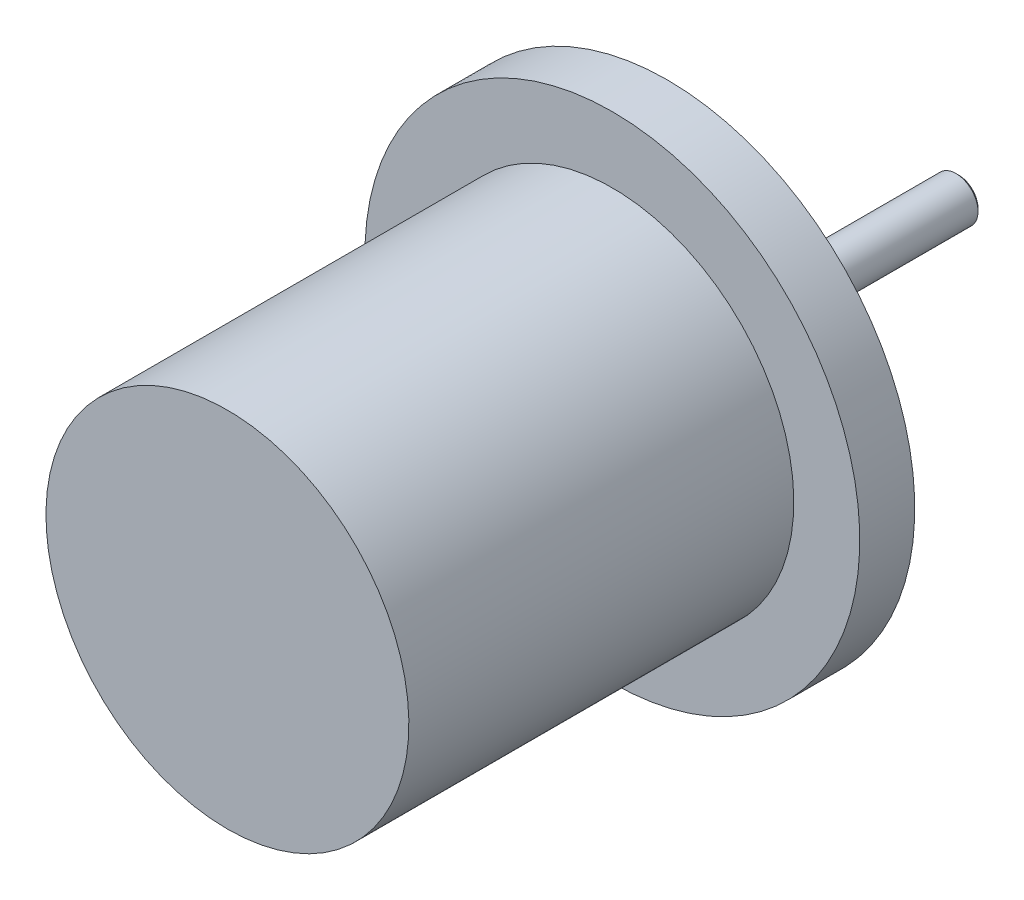
ISO-10303-21;
HEADER;
FILE_DESCRIPTION(('STEP AP214'),'2;1');
FILE_NAME('part.step','',(''),(''),'','','');
FILE_SCHEMA(('AUTOMOTIVE_DESIGN { 1 0 10303 214 1 1 1 1 }'));
ENDSEC;
DATA;
#1=APPLICATION_CONTEXT('core data for automotive mechanical design processes');
#2=APPLICATION_PROTOCOL_DEFINITION('international standard','automotive_design',2000,#1);
#3=PRODUCT_CONTEXT('',#1,'mechanical');
#4=PRODUCT('Part','Part','',(#3));
#5=PRODUCT_RELATED_PRODUCT_CATEGORY('part','',(#4));
#6=PRODUCT_DEFINITION_FORMATION('','',#4);
#7=PRODUCT_DEFINITION_CONTEXT('part definition',#1,'design');
#8=PRODUCT_DEFINITION('design','',#6,#7);
#9=PRODUCT_DEFINITION_SHAPE('','',#8);
#10=(LENGTH_UNIT() NAMED_UNIT(*) SI_UNIT(.MILLI.,.METRE.));
#11=(NAMED_UNIT(*) PLANE_ANGLE_UNIT() SI_UNIT($,.RADIAN.));
#12=(NAMED_UNIT(*) SI_UNIT($,.STERADIAN.) SOLID_ANGLE_UNIT());
#13=UNCERTAINTY_MEASURE_WITH_UNIT(LENGTH_MEASURE(1.E-05),#10,'distance_accuracy_value','');
#14=(GEOMETRIC_REPRESENTATION_CONTEXT(3) GLOBAL_UNCERTAINTY_ASSIGNED_CONTEXT((#13)) GLOBAL_UNIT_ASSIGNED_CONTEXT((#10,
#11,#12)) REPRESENTATION_CONTEXT('',''));
#15=CARTESIAN_POINT('',(0.,0.,0.));
#16=DIRECTION('',(0.,0.,1.));
#17=DIRECTION('',(1.,0.,0.));
#18=AXIS2_PLACEMENT_3D('',#15,#16,#17);
#19=CARTESIAN_POINT('',(0.,33.,67.7838573658607));
#20=DIRECTION('',(0.,0.,-1.));
#21=DIRECTION('',(0.,1.,0.));
#22=AXIS2_PLACEMENT_3D('',#19,#20,#21);
#23=PLANE('',#22);
#24=CARTESIAN_POINT('',(0.,0.,67.7838573658607));
#25=DIRECTION('',(0.,0.,1.));
#26=DIRECTION('',(0.,-1.,0.));
#27=AXIS2_PLACEMENT_3D('',#24,#25,#26);
#28=CIRCLE('',#27,33.);
#29=CARTESIAN_POINT('',(0.,-33.,67.7838573658607));
#30=VERTEX_POINT('',#29);
#31=EDGE_CURVE('E107',#30,#30,#28,.T.);
#32=ORIENTED_EDGE('',*,*,#31,.T.);
#33=EDGE_LOOP('',(#32));
#34=FACE_BOUND('',#33,.T.);
#35=ADVANCED_FACE('F34',(#34),#23,.F.);
#36=CARTESIAN_POINT('',(0.,4.,-65.2161426341393));
#37=DIRECTION('',(0.,0.,1.));
#38=DIRECTION('',(0.,-1.,0.));
#39=AXIS2_PLACEMENT_3D('',#36,#37,#38);
#40=PLANE('',#39);
#41=CARTESIAN_POINT('',(0.,0.,-65.2161426341393));
#42=DIRECTION('',(0.,0.,1.));
#43=DIRECTION('',(0.,-1.,0.));
#44=AXIS2_PLACEMENT_3D('',#41,#42,#43);
#45=CIRCLE('',#44,3.49999999999995);
#46=CARTESIAN_POINT('',(0.,-3.49999999999995,-65.2161426341393));
#47=VERTEX_POINT('',#46);
#48=EDGE_CURVE('E11',#47,#47,#45,.F.);
#49=ORIENTED_EDGE('',*,*,#48,.T.);
#50=EDGE_LOOP('',(#49));
#51=FACE_BOUND('',#50,.T.);
#52=CARTESIAN_POINT('',(0.,0.,-65.2161426341393));
#53=DIRECTION('',(0.,0.,-1.));
#54=DIRECTION('',(0.,1.,0.));
#55=AXIS2_PLACEMENT_3D('',#52,#53,#54);
#56=CIRCLE('',#55,1.5);
#57=CARTESIAN_POINT('',(0.,1.50000000000001,-65.2161426341393));
#58=VERTEX_POINT('',#57);
#59=EDGE_CURVE('E243',#58,#58,#56,.T.);
#60=ORIENTED_EDGE('',*,*,#59,.F.);
#61=EDGE_LOOP('',(#60));
#62=FACE_BOUND('',#61,.T.);
#63=ADVANCED_FACE('F193',(#51,#62),#40,.F.);
#64=CARTESIAN_POINT('',(0.,0.,67.7838573658607));
#65=DIRECTION('',(0.,0.,1.));
#66=DIRECTION('',(0.,-1.,0.));
#67=AXIS2_PLACEMENT_3D('',#64,#65,#66);
#68=CYLINDRICAL_SURFACE('',#67,4.);
#69=CARTESIAN_POINT('',(0.,0.,-64.7161426341393));
#70=DIRECTION('',(0.,0.,1.));
#71=DIRECTION('',(0.,-1.,0.));
#72=AXIS2_PLACEMENT_3D('',#69,#70,#71);
#73=CIRCLE('',#72,4.);
#74=CARTESIAN_POINT('',(0.,-4.,-64.7161426341393));
#75=VERTEX_POINT('',#74);
#76=EDGE_CURVE('E42',#75,#75,#73,.T.);
#77=ORIENTED_EDGE('',*,*,#76,.T.);
#78=EDGE_LOOP('',(#77));
#79=FACE_BOUND('',#78,.T.);
#80=CARTESIAN_POINT('',(0.,0.,-31.2161426341393));
#81=DIRECTION('',(0.,0.,1.));
#82=DIRECTION('',(0.,-1.,0.));
#83=AXIS2_PLACEMENT_3D('',#80,#81,#82);
#84=CIRCLE('',#83,4.);
#85=CARTESIAN_POINT('',(0.,-4.00000000000001,-31.2161426341393));
#86=VERTEX_POINT('',#85);
#87=EDGE_CURVE('E131',#86,#86,#84,.T.);
#88=ORIENTED_EDGE('',*,*,#87,.F.);
#89=EDGE_LOOP('',(#88));
#90=FACE_BOUND('',#89,.T.);
#91=ADVANCED_FACE('F199',(#79,#90),#68,.T.);
#92=CARTESIAN_POINT('',(0.,6.,-31.2161426341393));
#93=DIRECTION('',(0.,0.,1.));
#94=DIRECTION('',(0.,-1.,0.));
#95=AXIS2_PLACEMENT_3D('',#92,#93,#94);
#96=PLANE('',#95);
#97=CARTESIAN_POINT('',(0.,0.,-31.2161426341393));
#98=DIRECTION('',(0.,0.,1.));
#99=DIRECTION('',(0.,-1.,0.));
#100=AXIS2_PLACEMENT_3D('',#97,#98,#99);
#101=CIRCLE('',#100,5.49999999999996);
#102=CARTESIAN_POINT('',(0.,-5.49999999999997,-31.2161426341393));
#103=VERTEX_POINT('',#102);
#104=EDGE_CURVE('E217',#103,#103,#101,.F.);
#105=ORIENTED_EDGE('',*,*,#104,.T.);
#106=EDGE_LOOP('',(#105));
#107=FACE_BOUND('',#106,.T.);
#108=ORIENTED_EDGE('',*,*,#87,.T.);
#109=EDGE_LOOP('',(#108));
#110=FACE_BOUND('',#109,.T.);
#111=ADVANCED_FACE('F188',(#107,#110),#96,.F.);
#112=CARTESIAN_POINT('',(0.,0.,67.7838573658607));
#113=DIRECTION('',(0.,0.,1.));
#114=DIRECTION('',(0.,-1.,0.));
#115=AXIS2_PLACEMENT_3D('',#112,#113,#114);
#116=CYLINDRICAL_SURFACE('',#115,6.);
#117=CARTESIAN_POINT('',(0.,0.,-30.7161426341393));
#118=DIRECTION('',(0.,0.,1.));
#119=DIRECTION('',(0.,-1.,0.));
#120=AXIS2_PLACEMENT_3D('',#117,#118,#119);
#121=CIRCLE('',#120,6.);
#122=CARTESIAN_POINT('',(0.,-6.00000000000001,-30.7161426341393));
#123=VERTEX_POINT('',#122);
#124=EDGE_CURVE('E220',#123,#123,#121,.T.);
#125=ORIENTED_EDGE('',*,*,#124,.T.);
#126=EDGE_LOOP('',(#125));
#127=FACE_BOUND('',#126,.T.);
#128=DIRECTION('',(0.,0.,1.));
#129=VECTOR('',#128,1.);
#130=CARTESIAN_POINT('',(-2.02500000000001,5.64795316906929,67.7838573658607));
#131=LINE('',#130,#129);
#132=CARTESIAN_POINT('',(-2.025,5.6479531690693,-20.7322674361881));
#133=VERTEX_POINT('',#132);
#134=CARTESIAN_POINT('',(-2.025,5.64795316906931,-27.6822674361881));
#135=VERTEX_POINT('',#134);
#136=EDGE_CURVE('E57',#133,#135,#131,.F.);
#137=ORIENTED_EDGE('',*,*,#136,.T.);
#138=CARTESIAN_POINT('',(-2.025,5.64795316906931,-27.6822674361881));
#139=CARTESIAN_POINT('',(-2.02500732840921,5.64794421835024,-27.7374714873766));
#140=CARTESIAN_POINT('',(-2.02274276383207,5.64876231971885,-27.7926705480385));
#141=CARTESIAN_POINT('',(-2.01372694945185,5.65198598559758,-27.9026395625626));
#142=CARTESIAN_POINT('',(-2.00697693812913,5.65439111191167,-27.9574096306518));
#143=CARTESIAN_POINT('',(-1.9890742446075,5.66071273096918,-28.0659689008482));
#144=CARTESIAN_POINT('',(-1.97793486936142,5.66462465485257,-28.1197605582248));
#145=CARTESIAN_POINT('',(-1.95136811115307,5.6738310640627,-28.2261397341808));
#146=CARTESIAN_POINT('',(-1.9359405674071,5.67912560122968,-28.2787272075297));
#147=CARTESIAN_POINT('',(-1.88343283918046,5.6968465981435,-28.4340808283565));
#148=CARTESIAN_POINT('',(-1.84010019012467,5.71112072916625,-28.5346020864765));
#149=CARTESIAN_POINT('',(-1.73813548038652,5.74297152927926,-28.7269645521297));
#150=CARTESIAN_POINT('',(-1.67949372626912,5.76055028881661,-28.8188002097356));
#151=CARTESIAN_POINT('',(-1.54606111681819,5.79781470454823,-28.9948795619653));
#152=CARTESIAN_POINT('',(-1.47076235572118,5.81755360533793,-29.0787278971856));
#153=CARTESIAN_POINT('',(-1.30723776980743,5.85646521029333,-29.2328759097395));
#154=CARTESIAN_POINT('',(-1.21900963081884,5.87563781236005,-29.3031731563978));
#155=CARTESIAN_POINT('',(-1.02920684316672,5.91187797427859,-29.4300456486804));
#156=CARTESIAN_POINT('',(-0.927337576379303,5.92887523911479,-29.4862020438973));
#157=CARTESIAN_POINT('',(-0.71492996813865,5.95821680774617,-29.5804210659849));
#158=CARTESIAN_POINT('',(-0.604394342469941,5.97056256220434,-29.6184893349545));
#159=CARTESIAN_POINT('',(-0.381963554882021,5.98883184581268,-29.674100446687));
#160=CARTESIAN_POINT('',(-0.270256796239186,5.99496830882544,-29.6923255850205));
#161=CARTESIAN_POINT('',(-0.0452112086042894,6.00088430548382,-29.7099041670532));
#162=CARTESIAN_POINT('',(0.0681272140816217,6.0006653952434,-29.7092622303577));
#163=CARTESIAN_POINT('',(0.28837990293057,5.99403851392003,-29.6895535764033));
#164=CARTESIAN_POINT('',(0.395369266385033,5.98787968386522,-29.6712285340625));
#165=CARTESIAN_POINT('',(0.604652608873588,5.97037922999004,-29.6179026550561));
#166=CARTESIAN_POINT('',(0.706946326030568,5.95903731749367,-29.5829008895621));
#167=CARTESIAN_POINT('',(0.905540190726125,5.93213122250377,-29.496790692514));
#168=CARTESIAN_POINT('',(1.00174235790383,5.91651281311449,-29.4454739358055));
#169=CARTESIAN_POINT('',(1.18438634734529,5.88267534938129,-29.3283631068033));
#170=CARTESIAN_POINT('',(1.27082544836656,5.86445557315111,-29.2625650131462));
#171=CARTESIAN_POINT('',(1.43589141999519,5.82629719198889,-29.1146448811297));
#172=CARTESIAN_POINT('',(1.51394243657137,5.80631806506245,-29.0318898305775));
#173=CARTESIAN_POINT('',(1.65526151365416,5.76762449341404,-28.8542806859748));
#174=CARTESIAN_POINT('',(1.71852471978186,5.7489104654137,-28.7594226346372));
#175=CARTESIAN_POINT('',(1.82930798744989,5.71463541869885,-28.5584136126276));
#176=CARTESIAN_POINT('',(1.87656981434924,5.69912756039588,-28.4521108555253));
#177=CARTESIAN_POINT('',(1.95227067243037,5.67364608725358,-28.2324545703897));
#178=CARTESIAN_POINT('',(1.98073956634889,5.66366369631801,-28.1191125431851));
#179=CARTESIAN_POINT('',(2.00782551290783,5.65408750042824,-27.9509266121996));
#180=CARTESIAN_POINT('',(2.01426301751214,5.65179383809439,-27.8973911742358));
#181=CARTESIAN_POINT('',(2.02284760016312,5.64872552526426,-27.7900026058467));
#182=CARTESIAN_POINT('',(2.02500009207323,5.64794895803004,-27.7361499626292));
#183=CARTESIAN_POINT('',(2.025,5.6479531690693,-27.6822674361881));
#184=B_SPLINE_CURVE_WITH_KNOTS('',3,(#138,#139,#140,#141,#142,#143,#144,#145,#146,#147,#148,
#149,#150,#151,#152,#153,#154,#155,#156,#157,#158,#159,#160,#161,#162,#163,#164,#165,#166,#167,
#168,#169,#170,#171,#172,#173,#174,#175,#176,#177,#178,#179,#180,#181,#182,#183),.UNSPECIFIED.,
.F.,.F.,(4,2,2,2,2,2,2,2,2,2,2,2,2,2,2,2,2,2,2,2,2,2,4),(0.,0.165551238664834,0.331056785824469,
0.496064393801619,0.661078189528179,0.990612567342201,1.32035610829515,1.6620406538957,
2.00378643095773,2.35470292179314,2.7055098818028,3.04383133161589,3.38206994407701,
3.70671207197223,4.03137228327983,4.36035685006571,4.68943288903299,5.0343395131954,
5.37935920098345,5.72970753186083,6.07949779617867,6.24124273803835,6.40278319457758),.UNSPECIFIED.);
#185=CARTESIAN_POINT('',(2.025,5.6479531690693,-27.6822674361881));
#186=VERTEX_POINT('',#185);
#187=EDGE_CURVE('E134',#135,#186,#184,.T.);
#188=ORIENTED_EDGE('',*,*,#187,.T.);
#189=DIRECTION('',(0.,0.,1.));
#190=VECTOR('',#189,1.);
#191=CARTESIAN_POINT('',(2.02500000000001,5.64795316906929,67.7838573658607));
#192=LINE('',#191,#190);
#193=CARTESIAN_POINT('',(2.02500000000001,5.6479531690693,-20.7322674361881));
#194=VERTEX_POINT('',#193);
#195=EDGE_CURVE('E223',#186,#194,#192,.T.);
#196=ORIENTED_EDGE('',*,*,#195,.T.);
#197=CARTESIAN_POINT('',(2.025,5.6479531690693,-20.7322674361881));
#198=CARTESIAN_POINT('',(2.02500732840921,5.64794421835024,-20.6770633849996));
#199=CARTESIAN_POINT('',(2.02274276383207,5.64876231971884,-20.6218643243377));
#200=CARTESIAN_POINT('',(2.01372694945185,5.65198598559758,-20.5118953098136));
#201=CARTESIAN_POINT('',(2.00697693812913,5.65439111191167,-20.4571252417244));
#202=CARTESIAN_POINT('',(1.9890742446075,5.66071273096917,-20.348565971528));
#203=CARTESIAN_POINT('',(1.97793486936142,5.66462465485257,-20.2947743141514));
#204=CARTESIAN_POINT('',(1.95136811115307,5.6738310640627,-20.1883951381954));
#205=CARTESIAN_POINT('',(1.9359405674071,5.67912560122968,-20.1358076648465));
#206=CARTESIAN_POINT('',(1.88343283918046,5.69684659814349,-19.9804540440197));
#207=CARTESIAN_POINT('',(1.84010019012467,5.71112072916625,-19.8799327858997));
#208=CARTESIAN_POINT('',(1.73813548038652,5.74297152927926,-19.6875703202465));
#209=CARTESIAN_POINT('',(1.67949372626912,5.76055028881661,-19.5957346626406));
#210=CARTESIAN_POINT('',(1.54606111681819,5.79781470454823,-19.4196553104109));
#211=CARTESIAN_POINT('',(1.47076235572118,5.81755360533793,-19.3358069751906));
#212=CARTESIAN_POINT('',(1.30723776980743,5.85646521029333,-19.1816589626367));
#213=CARTESIAN_POINT('',(1.21900963081884,5.87563781236005,-19.1113617159784));
#214=CARTESIAN_POINT('',(1.02920684316672,5.91187797427859,-18.9844892236958));
#215=CARTESIAN_POINT('',(0.927337576379305,5.92887523911479,-18.9283328284789));
#216=CARTESIAN_POINT('',(0.714929968138651,5.95821680774617,-18.8341138063913));
#217=CARTESIAN_POINT('',(0.604394342469941,5.97056256220434,-18.7960455374217));
#218=CARTESIAN_POINT('',(0.381963554882021,5.98883184581268,-18.7404344256892));
#219=CARTESIAN_POINT('',(0.270256796239186,5.99496830882544,-18.7222092873557));
#220=CARTESIAN_POINT('',(0.0452112086042901,6.00088430548381,-18.704630705323));
#221=CARTESIAN_POINT('',(-0.0681272140816209,6.0006653952434,-18.7052726420185));
#222=CARTESIAN_POINT('',(-0.288379902930569,5.99403851392002,-18.7249812959729));
#223=CARTESIAN_POINT('',(-0.395369266385032,5.98787968386522,-18.7433063383137));
#224=CARTESIAN_POINT('',(-0.604652608873587,5.97037922999004,-18.7966322173201));
#225=CARTESIAN_POINT('',(-0.706946326030568,5.95903731749367,-18.8316339828141));
#226=CARTESIAN_POINT('',(-0.905540190726125,5.93213122250377,-18.9177441798622));
#227=CARTESIAN_POINT('',(-1.00174235790383,5.91651281311449,-18.9690609365707));
#228=CARTESIAN_POINT('',(-1.18438634734529,5.88267534938129,-19.0861717655729));
#229=CARTESIAN_POINT('',(-1.27082544836656,5.8644555731511,-19.15196985923));
#230=CARTESIAN_POINT('',(-1.43589141999519,5.82629719198889,-19.2998899912465));
#231=CARTESIAN_POINT('',(-1.51394243657138,5.80631806506245,-19.3826450417988));
#232=CARTESIAN_POINT('',(-1.65526151365416,5.76762449341404,-19.5602541864015));
#233=CARTESIAN_POINT('',(-1.71852471978186,5.7489104654137,-19.655112237739));
#234=CARTESIAN_POINT('',(-1.82930798744989,5.71463541869885,-19.8561212597487));
#235=CARTESIAN_POINT('',(-1.87656981434924,5.69912756039588,-19.9624240168509));
#236=CARTESIAN_POINT('',(-1.95227067243037,5.67364608725358,-20.1820803019865));
#237=CARTESIAN_POINT('',(-1.98073956634889,5.66366369631801,-20.2954223291911));
#238=CARTESIAN_POINT('',(-2.00782551290783,5.65408750042823,-20.4636082601766));
#239=CARTESIAN_POINT('',(-2.01426301751214,5.65179383809439,-20.5171436981404));
#240=CARTESIAN_POINT('',(-2.02284760016312,5.64872552526426,-20.6245322665296));
#241=CARTESIAN_POINT('',(-2.02500009207323,5.64794895803004,-20.678384909747));
#242=CARTESIAN_POINT('',(-2.025,5.6479531690693,-20.7322674361881));
#243=B_SPLINE_CURVE_WITH_KNOTS('',3,(#197,#198,#199,#200,#201,#202,#203,#204,#205,#206,#207,
#208,#209,#210,#211,#212,#213,#214,#215,#216,#217,#218,#219,#220,#221,#222,#223,#224,#225,#226,
#227,#228,#229,#230,#231,#232,#233,#234,#235,#236,#237,#238,#239,#240,#241,#242),.UNSPECIFIED.,
.F.,.F.,(4,2,2,2,2,2,2,2,2,2,2,2,2,2,2,2,2,2,2,2,2,2,4),(0.,0.165551238664838,0.331056785824472,
0.496064393801626,0.661078189528179,0.990612567342205,1.32035610829515,1.6620406538957,
2.00378643095773,2.35470292179314,2.7055098818028,3.04383133161589,3.38206994407701,
3.70671207197223,4.03137228327983,4.36035685006571,4.68943288903299,5.0343395131954,
5.37935920098345,5.72970753186083,6.07949779617867,6.24124273803835,6.40278319457758),.UNSPECIFIED.);
#244=EDGE_CURVE('E49',#194,#133,#243,.T.);
#245=ORIENTED_EDGE('',*,*,#244,.T.);
#246=EDGE_LOOP('',(#137,#188,#196,#245));
#247=FACE_BOUND('',#246,.T.);
#248=CARTESIAN_POINT('',(0.,0.,-15.2161426341393));
#249=DIRECTION('',(0.,0.,1.));
#250=DIRECTION('',(0.,-1.,0.));
#251=AXIS2_PLACEMENT_3D('',#248,#249,#250);
#252=CIRCLE('',#251,6.);
#253=CARTESIAN_POINT('',(0.,-6.00000000000001,-15.2161426341393));
#254=VERTEX_POINT('',#253);
#255=EDGE_CURVE('E128',#254,#254,#252,.T.);
#256=ORIENTED_EDGE('',*,*,#255,.F.);
#257=EDGE_LOOP('',(#256));
#258=FACE_BOUND('',#257,.T.);
#259=ADVANCED_FACE('F147',(#127,#247,#258),#116,.T.);
#260=CARTESIAN_POINT('',(0.,6.,-15.2161426341393));
#261=DIRECTION('',(0.,0.,1.));
#262=DIRECTION('',(0.,-1.,0.));
#263=AXIS2_PLACEMENT_3D('',#260,#261,#262);
#264=PLANE('',#263);
#265=CARTESIAN_POINT('',(0.,0.,-15.2161426341393));
#266=DIRECTION('',(0.,0.,1.));
#267=DIRECTION('',(0.,-1.,0.));
#268=AXIS2_PLACEMENT_3D('',#265,#266,#267);
#269=CIRCLE('',#268,17.5);
#270=CARTESIAN_POINT('',(0.,-17.5,-15.2161426341393));
#271=VERTEX_POINT('',#270);
#272=EDGE_CURVE('E125',#271,#271,#269,.T.);
#273=ORIENTED_EDGE('',*,*,#272,.F.);
#274=EDGE_LOOP('',(#273));
#275=FACE_BOUND('',#274,.T.);
#276=ORIENTED_EDGE('',*,*,#255,.T.);
#277=EDGE_LOOP('',(#276));
#278=FACE_BOUND('',#277,.T.);
#279=ADVANCED_FACE('F181',(#275,#278),#264,.F.);
#280=CARTESIAN_POINT('',(0.,0.,67.7838573658607));
#281=DIRECTION('',(0.,0.,1.));
#282=DIRECTION('',(0.,-1.,0.));
#283=AXIS2_PLACEMENT_3D('',#280,#281,#282);
#284=CYLINDRICAL_SURFACE('',#283,17.5);
#285=CARTESIAN_POINT('',(0.,0.,-12.2161426341393));
#286=DIRECTION('',(0.,0.,1.));
#287=DIRECTION('',(0.,-1.,0.));
#288=AXIS2_PLACEMENT_3D('',#285,#286,#287);
#289=CIRCLE('',#288,17.5);
#290=CARTESIAN_POINT('',(0.,-17.5,-12.2161426341393));
#291=VERTEX_POINT('',#290);
#292=EDGE_CURVE('E122',#291,#291,#289,.T.);
#293=ORIENTED_EDGE('',*,*,#292,.F.);
#294=EDGE_LOOP('',(#293));
#295=FACE_BOUND('',#294,.T.);
#296=ORIENTED_EDGE('',*,*,#272,.T.);
#297=EDGE_LOOP('',(#296));
#298=FACE_BOUND('',#297,.T.);
#299=ADVANCED_FACE('F178',(#295,#298),#284,.T.);
#300=CARTESIAN_POINT('',(0.,45.,-12.2161426341393));
#301=DIRECTION('',(0.,0.,1.));
#302=DIRECTION('',(0.,-1.,0.));
#303=AXIS2_PLACEMENT_3D('',#300,#301,#302);
#304=PLANE('',#303);
#305=CARTESIAN_POINT('',(0.,35.,-12.2161426341393));
#306=DIRECTION('',(0.,0.,-1.));
#307=DIRECTION('',(0.,1.,0.));
#308=AXIS2_PLACEMENT_3D('',#305,#306,#307);
#309=CIRCLE('',#308,3.);
#310=CARTESIAN_POINT('',(0.,38.,-12.2161426341393));
#311=VERTEX_POINT('',#310);
#312=EDGE_CURVE('E248',#311,#311,#309,.T.);
#313=ORIENTED_EDGE('',*,*,#312,.F.);
#314=EDGE_LOOP('',(#313));
#315=FACE_BOUND('',#314,.T.);
#316=CARTESIAN_POINT('',(-24.74873734153,24.7487373415313,-12.2161426341393));
#317=DIRECTION('',(0.,0.,-1.));
#318=DIRECTION('',(0.,1.,0.));
#319=AXIS2_PLACEMENT_3D('',#316,#317,#318);
#320=CIRCLE('',#319,3.00000000000028);
#321=CARTESIAN_POINT('',(-24.74873734153,27.7487373415316,-12.2161426341393));
#322=VERTEX_POINT('',#321);
#323=EDGE_CURVE('E254',#322,#322,#320,.T.);
#324=ORIENTED_EDGE('',*,*,#323,.F.);
#325=EDGE_LOOP('',(#324));
#326=FACE_BOUND('',#325,.T.);
#327=CARTESIAN_POINT('',(-35.000000000003,2.98115864863101E-12,-12.2161426341393));
#328=DIRECTION('',(0.,0.,-1.));
#329=DIRECTION('',(0.,1.,0.));
#330=AXIS2_PLACEMENT_3D('',#327,#328,#329);
#331=CIRCLE('',#330,3.0000000000021);
#332=CARTESIAN_POINT('',(-35.000000000003,3.00000000000508,-12.2161426341393));
#333=VERTEX_POINT('',#332);
#334=EDGE_CURVE('E260',#333,#333,#331,.T.);
#335=ORIENTED_EDGE('',*,*,#334,.F.);
#336=EDGE_LOOP('',(#335));
#337=FACE_BOUND('',#336,.T.);
#338=CARTESIAN_POINT('',(-24.7487373415343,-24.7487373415271,-12.2161426341393));
#339=DIRECTION('',(0.,0.,-1.));
#340=DIRECTION('',(0.,1.,0.));
#341=AXIS2_PLACEMENT_3D('',#338,#339,#340);
#342=CIRCLE('',#341,3.00000000000442);
#343=CARTESIAN_POINT('',(-24.7487373415343,-21.7487373415226,-12.2161426341393));
#344=VERTEX_POINT('',#343);
#345=EDGE_CURVE('E266',#344,#344,#342,.T.);
#346=ORIENTED_EDGE('',*,*,#345,.F.);
#347=EDGE_LOOP('',(#346));
#348=FACE_BOUND('',#347,.T.);
#349=CARTESIAN_POINT('',(-5.95998645279081E-12,-35.,-12.2161426341393));
#350=DIRECTION('',(0.,0.,-1.));
#351=DIRECTION('',(0.,1.,0.));
#352=AXIS2_PLACEMENT_3D('',#349,#350,#351);
#353=CIRCLE('',#352,3.00000000000594);
#354=CARTESIAN_POINT('',(-5.95998645279081E-12,-31.9999999999941,-12.2161426341393));
#355=VERTEX_POINT('',#354);
#356=EDGE_CURVE('E272',#355,#355,#353,.T.);
#357=ORIENTED_EDGE('',*,*,#356,.F.);
#358=EDGE_LOOP('',(#357));
#359=FACE_BOUND('',#358,.T.);
#360=CARTESIAN_POINT('',(24.7487373415241,-24.7487373415313,-12.2161426341393));
#361=DIRECTION('',(0.,0.,-1.));
#362=DIRECTION('',(0.,1.,0.));
#363=AXIS2_PLACEMENT_3D('',#360,#361,#362);
#364=CIRCLE('',#363,3.00000000000577);
#365=CARTESIAN_POINT('',(24.7487373415241,-21.7487373415255,-12.2161426341393));
#366=VERTEX_POINT('',#365);
#367=EDGE_CURVE('E278',#366,#366,#364,.T.);
#368=ORIENTED_EDGE('',*,*,#367,.F.);
#369=EDGE_LOOP('',(#368));
#370=FACE_BOUND('',#369,.T.);
#371=CARTESIAN_POINT('',(34.999999999997,-2.98311406795682E-12,-12.2161426341393));
#372=DIRECTION('',(0.,0.,-1.));
#373=DIRECTION('',(0.,1.,0.));
#374=AXIS2_PLACEMENT_3D('',#371,#372,#373);
#375=CIRCLE('',#374,3.00000000000408);
#376=CARTESIAN_POINT('',(34.999999999997,3.0000000000011,-12.2161426341393));
#377=VERTEX_POINT('',#376);
#378=EDGE_CURVE('E284',#377,#377,#375,.T.);
#379=ORIENTED_EDGE('',*,*,#378,.F.);
#380=EDGE_LOOP('',(#379));
#381=FACE_BOUND('',#380,.T.);
#382=CARTESIAN_POINT('',(24.7487373415283,24.7487373415271,-12.2161426341393));
#383=DIRECTION('',(0.,0.,-1.));
#384=DIRECTION('',(0.,1.,0.));
#385=AXIS2_PLACEMENT_3D('',#382,#383,#384);
#386=CIRCLE('',#385,3.00000000000187);
#387=CARTESIAN_POINT('',(24.7487373415283,27.7487373415289,-12.2161426341393));
#388=VERTEX_POINT('',#387);
#389=EDGE_CURVE('E99',#388,#388,#386,.T.);
#390=ORIENTED_EDGE('',*,*,#389,.F.);
#391=EDGE_LOOP('',(#390));
#392=FACE_BOUND('',#391,.T.);
#393=CARTESIAN_POINT('',(0.,0.,-12.2161426341393));
#394=DIRECTION('',(0.,0.,1.));
#395=DIRECTION('',(0.,-1.,0.));
#396=AXIS2_PLACEMENT_3D('',#393,#394,#395);
#397=CIRCLE('',#396,45.);
#398=CARTESIAN_POINT('',(0.,-45.,-12.2161426341393));
#399=VERTEX_POINT('',#398);
#400=EDGE_CURVE('E119',#399,#399,#397,.T.);
#401=ORIENTED_EDGE('',*,*,#400,.F.);
#402=EDGE_LOOP('',(#401));
#403=FACE_BOUND('',#402,.T.);
#404=ORIENTED_EDGE('',*,*,#292,.T.);
#405=EDGE_LOOP('',(#404));
#406=FACE_BOUND('',#405,.T.);
#407=ADVANCED_FACE('F174',(#315,#326,#337,#348,#359,#370,#381,#392,#403,#406),#304,.F.);
#408=CARTESIAN_POINT('',(0.,0.,67.7838573658607));
#409=DIRECTION('',(0.,0.,1.));
#410=DIRECTION('',(0.,-1.,0.));
#411=AXIS2_PLACEMENT_3D('',#408,#409,#410);
#412=CYLINDRICAL_SURFACE('',#411,45.);
#413=CARTESIAN_POINT('',(0.,0.,-2.21614263413931));
#414=DIRECTION('',(0.,0.,1.));
#415=DIRECTION('',(0.,-1.,0.));
#416=AXIS2_PLACEMENT_3D('',#413,#414,#415);
#417=CIRCLE('',#416,45.);
#418=CARTESIAN_POINT('',(0.,-45.,-2.21614263413932));
#419=VERTEX_POINT('',#418);
#420=EDGE_CURVE('E116',#419,#419,#417,.T.);
#421=ORIENTED_EDGE('',*,*,#420,.F.);
#422=EDGE_LOOP('',(#421));
#423=FACE_BOUND('',#422,.T.);
#424=ORIENTED_EDGE('',*,*,#400,.T.);
#425=EDGE_LOOP('',(#424));
#426=FACE_BOUND('',#425,.T.);
#427=ADVANCED_FACE('F170',(#423,#426),#412,.T.);
#428=CARTESIAN_POINT('',(0.,45.,-2.21614263413931));
#429=DIRECTION('',(0.,0.,-1.));
#430=DIRECTION('',(0.,1.,0.));
#431=AXIS2_PLACEMENT_3D('',#428,#429,#430);
#432=PLANE('',#431);
#433=CARTESIAN_POINT('',(0.,0.,-2.21614263413931));
#434=DIRECTION('',(0.,0.,1.));
#435=DIRECTION('',(0.,-1.,0.));
#436=AXIS2_PLACEMENT_3D('',#433,#434,#435);
#437=CIRCLE('',#436,33.);
#438=CARTESIAN_POINT('',(0.,-33.,-2.21614263413932));
#439=VERTEX_POINT('',#438);
#440=EDGE_CURVE('E113',#439,#439,#437,.T.);
#441=ORIENTED_EDGE('',*,*,#440,.F.);
#442=EDGE_LOOP('',(#441));
#443=FACE_BOUND('',#442,.T.);
#444=ORIENTED_EDGE('',*,*,#420,.T.);
#445=EDGE_LOOP('',(#444));
#446=FACE_BOUND('',#445,.T.);
#447=ADVANCED_FACE('F166',(#443,#446),#432,.F.);
#448=CARTESIAN_POINT('',(0.,0.,67.7838573658607));
#449=DIRECTION('',(0.,0.,1.));
#450=DIRECTION('',(0.,-1.,0.));
#451=AXIS2_PLACEMENT_3D('',#448,#449,#450);
#452=CYLINDRICAL_SURFACE('',#451,33.);
#453=ORIENTED_EDGE('',*,*,#31,.F.);
#454=EDGE_LOOP('',(#453));
#455=FACE_BOUND('',#454,.T.);
#456=ORIENTED_EDGE('',*,*,#440,.T.);
#457=EDGE_LOOP('',(#456));
#458=FACE_BOUND('',#457,.T.);
#459=ADVANCED_FACE('F163',(#455,#458),#452,.T.);
#460=CARTESIAN_POINT('',(0.,3.5,-20.7322674361881));
#461=DIRECTION('',(0.,1.,0.));
#462=DIRECTION('',(0.,0.,1.));
#463=AXIS2_PLACEMENT_3D('',#460,#461,#462);
#464=CYLINDRICAL_SURFACE('',#463,2.025);
#465=DIRECTION('',(0.,1.,0.));
#466=VECTOR('',#465,1.);
#467=CARTESIAN_POINT('',(2.025,3.5,-20.7322674361881));
#468=LINE('',#467,#466);
#469=CARTESIAN_POINT('',(2.025,3.5,-20.7322674361881));
#470=VERTEX_POINT('',#469);
#471=EDGE_CURVE('E74',#470,#194,#468,.T.);
#472=ORIENTED_EDGE('',*,*,#471,.F.);
#473=CARTESIAN_POINT('',(0.,3.5,-20.7322674361881));
#474=DIRECTION('',(0.,1.,0.));
#475=DIRECTION('',(0.,0.,1.));
#476=AXIS2_PLACEMENT_3D('',#473,#474,#475);
#477=CIRCLE('',#476,2.025);
#478=CARTESIAN_POINT('',(-2.025,3.5,-20.7322674361881));
#479=VERTEX_POINT('',#478);
#480=EDGE_CURVE('E78',#479,#470,#477,.T.);
#481=ORIENTED_EDGE('',*,*,#480,.F.);
#482=DIRECTION('',(0.,1.,0.));
#483=VECTOR('',#482,1.);
#484=CARTESIAN_POINT('',(-2.025,3.5,-20.7322674361881));
#485=LINE('',#484,#483);
#486=EDGE_CURVE('E105',#479,#133,#485,.T.);
#487=ORIENTED_EDGE('',*,*,#486,.T.);
#488=ORIENTED_EDGE('',*,*,#244,.F.);
#489=EDGE_LOOP('',(#472,#481,#487,#488));
#490=FACE_BOUND('',#489,.T.);
#491=ADVANCED_FACE('F76',(#490),#464,.F.);
#492=CARTESIAN_POINT('',(-2.025,3.5,-20.7322674361881));
#493=DIRECTION('',(-1.,0.,0.));
#494=DIRECTION('',(0.,0.,1.));
#495=AXIS2_PLACEMENT_3D('',#492,#493,#494);
#496=PLANE('',#495);
#497=ORIENTED_EDGE('',*,*,#486,.F.);
#498=DIRECTION('',(0.,0.,1.));
#499=VECTOR('',#498,1.);
#500=CARTESIAN_POINT('',(-2.025,3.5,-20.7322674361881));
#501=LINE('',#500,#499);
#502=CARTESIAN_POINT('',(-2.025,3.5,-27.6822674361881));
#503=VERTEX_POINT('',#502);
#504=EDGE_CURVE('E83',#503,#479,#501,.T.);
#505=ORIENTED_EDGE('',*,*,#504,.F.);
#506=DIRECTION('',(0.,1.,0.));
#507=VECTOR('',#506,1.);
#508=CARTESIAN_POINT('',(-2.025,3.5,-27.6822674361881));
#509=LINE('',#508,#507);
#510=EDGE_CURVE('E108',#503,#135,#509,.T.);
#511=ORIENTED_EDGE('',*,*,#510,.T.);
#512=ORIENTED_EDGE('',*,*,#136,.F.);
#513=EDGE_LOOP('',(#497,#505,#511,#512));
#514=FACE_BOUND('',#513,.T.);
#515=ADVANCED_FACE('F156',(#514),#496,.F.);
#516=CARTESIAN_POINT('',(0.,3.5,-27.6822674361881));
#517=DIRECTION('',(0.,1.,0.));
#518=DIRECTION('',(0.,0.,1.));
#519=AXIS2_PLACEMENT_3D('',#516,#517,#518);
#520=CYLINDRICAL_SURFACE('',#519,2.025);
#521=ORIENTED_EDGE('',*,*,#510,.F.);
#522=CARTESIAN_POINT('',(0.,3.5,-27.6822674361881));
#523=DIRECTION('',(0.,1.,0.));
#524=DIRECTION('',(0.,0.,1.));
#525=AXIS2_PLACEMENT_3D('',#522,#523,#524);
#526=CIRCLE('',#525,2.025);
#527=CARTESIAN_POINT('',(2.025,3.5,-27.6822674361881));
#528=VERTEX_POINT('',#527);
#529=EDGE_CURVE('E92',#528,#503,#526,.T.);
#530=ORIENTED_EDGE('',*,*,#529,.F.);
#531=DIRECTION('',(0.,1.,0.));
#532=VECTOR('',#531,1.);
#533=CARTESIAN_POINT('',(2.025,3.5,-27.6822674361881));
#534=LINE('',#533,#532);
#535=EDGE_CURVE('E82',#528,#186,#534,.T.);
#536=ORIENTED_EDGE('',*,*,#535,.T.);
#537=ORIENTED_EDGE('',*,*,#187,.F.);
#538=EDGE_LOOP('',(#521,#530,#536,#537));
#539=FACE_BOUND('',#538,.T.);
#540=ADVANCED_FACE('F151',(#539),#520,.F.);
#541=CARTESIAN_POINT('',(2.025,3.5,-27.6822674361881));
#542=DIRECTION('',(1.,0.,0.));
#543=DIRECTION('',(0.,0.,-1.));
#544=AXIS2_PLACEMENT_3D('',#541,#542,#543);
#545=PLANE('',#544);
#546=ORIENTED_EDGE('',*,*,#535,.F.);
#547=DIRECTION('',(0.,0.,-1.));
#548=VECTOR('',#547,1.);
#549=CARTESIAN_POINT('',(2.025,3.5,-27.6822674361881));
#550=LINE('',#549,#548);
#551=EDGE_CURVE('E86',#470,#528,#550,.T.);
#552=ORIENTED_EDGE('',*,*,#551,.F.);
#553=ORIENTED_EDGE('',*,*,#471,.T.);
#554=ORIENTED_EDGE('',*,*,#195,.F.);
#555=EDGE_LOOP('',(#546,#552,#553,#554));
#556=FACE_BOUND('',#555,.T.);
#557=ADVANCED_FACE('F87',(#556),#545,.F.);
#558=CARTESIAN_POINT('',(0.,3.5,-20.7322674361881));
#559=DIRECTION('',(0.,1.,0.));
#560=DIRECTION('',(0.,0.,1.));
#561=AXIS2_PLACEMENT_3D('',#558,#559,#560);
#562=PLANE('',#561);
#563=ORIENTED_EDGE('',*,*,#480,.T.);
#564=ORIENTED_EDGE('',*,*,#551,.T.);
#565=ORIENTED_EDGE('',*,*,#529,.T.);
#566=ORIENTED_EDGE('',*,*,#504,.T.);
#567=EDGE_LOOP('',(#563,#564,#565,#566));
#568=FACE_BOUND('',#567,.T.);
#569=ADVANCED_FACE('F94',(#568),#562,.T.);
#570=CARTESIAN_POINT('',(0.,0.,-30.7161426341393));
#571=DIRECTION('',(0.,0.,1.));
#572=DIRECTION('',(0.,-1.,0.));
#573=AXIS2_PLACEMENT_3D('',#570,#571,#572);
#574=CONICAL_SURFACE('',#573,6.,0.785398163397461);
#575=ORIENTED_EDGE('',*,*,#104,.F.);
#576=EDGE_LOOP('',(#575));
#577=FACE_BOUND('',#576,.T.);
#578=ORIENTED_EDGE('',*,*,#124,.F.);
#579=EDGE_LOOP('',(#578));
#580=FACE_BOUND('',#579,.T.);
#581=ADVANCED_FACE('F203',(#577,#580),#574,.T.);
#582=CARTESIAN_POINT('',(24.7487373415283,24.7487373415271,-9.21614263413931));
#583=DIRECTION('',(0.,0.,-1.));
#584=DIRECTION('',(0.,1.,0.));
#585=AXIS2_PLACEMENT_3D('',#582,#583,#584);
#586=CYLINDRICAL_SURFACE('',#585,3.00000000000187);
#587=CARTESIAN_POINT('',(24.7487373415283,24.7487373415271,-9.21614263413931));
#588=DIRECTION('',(0.,0.,-1.));
#589=DIRECTION('',(0.,1.,0.));
#590=AXIS2_PLACEMENT_3D('',#587,#588,#589);
#591=CIRCLE('',#590,3.00000000000187);
#592=CARTESIAN_POINT('',(24.7487373415283,27.7487373415289,-9.21614263413931));
#593=VERTEX_POINT('',#592);
#594=EDGE_CURVE('E96',#593,#593,#591,.T.);
#595=ORIENTED_EDGE('',*,*,#594,.F.);
#596=EDGE_LOOP('',(#595));
#597=FACE_BOUND('',#596,.T.);
#598=ORIENTED_EDGE('',*,*,#389,.T.);
#599=EDGE_LOOP('',(#598));
#600=FACE_BOUND('',#599,.T.);
#601=ADVANCED_FACE('F205',(#597,#600),#586,.F.);
#602=CARTESIAN_POINT('',(0.,0.,-9.21614263413931));
#603=DIRECTION('',(0.,0.,-1.));
#604=DIRECTION('',(0.,1.,0.));
#605=AXIS2_PLACEMENT_3D('',#602,#603,#604);
#606=PLANE('',#605);
#607=ORIENTED_EDGE('',*,*,#594,.T.);
#608=EDGE_LOOP('',(#607));
#609=FACE_BOUND('',#608,.T.);
#610=ADVANCED_FACE('F211',(#609),#606,.T.);
#611=CARTESIAN_POINT('',(34.999999999997,-2.98340026850404E-12,-9.21614263413931));
#612=DIRECTION('',(0.,0.,-1.));
#613=DIRECTION('',(0.,1.,0.));
#614=AXIS2_PLACEMENT_3D('',#611,#612,#613);
#615=CYLINDRICAL_SURFACE('',#614,3.00000000000408);
#616=CARTESIAN_POINT('',(34.999999999997,-2.98340026850404E-12,-9.21614263413931));
#617=DIRECTION('',(0.,0.,-1.));
#618=DIRECTION('',(0.,1.,0.));
#619=AXIS2_PLACEMENT_3D('',#616,#617,#618);
#620=CIRCLE('',#619,3.00000000000408);
#621=CARTESIAN_POINT('',(34.999999999997,3.0000000000011,-9.21614263413931));
#622=VERTEX_POINT('',#621);
#623=EDGE_CURVE('E287',#622,#622,#620,.T.);
#624=ORIENTED_EDGE('',*,*,#623,.F.);
#625=EDGE_LOOP('',(#624));
#626=FACE_BOUND('',#625,.T.);
#627=ORIENTED_EDGE('',*,*,#378,.T.);
#628=EDGE_LOOP('',(#627));
#629=FACE_BOUND('',#628,.T.);
#630=ADVANCED_FACE('F293',(#626,#629),#615,.F.);
#631=CARTESIAN_POINT('',(0.,0.,-9.21614263413931));
#632=DIRECTION('',(0.,0.,-1.));
#633=DIRECTION('',(0.,1.,0.));
#634=AXIS2_PLACEMENT_3D('',#631,#632,#633);
#635=PLANE('',#634);
#636=ORIENTED_EDGE('',*,*,#623,.T.);
#637=EDGE_LOOP('',(#636));
#638=FACE_BOUND('',#637,.T.);
#639=ADVANCED_FACE('F306',(#638),#635,.T.);
#640=CARTESIAN_POINT('',(24.7487373415241,-24.7487373415313,-9.21614263413931));
#641=DIRECTION('',(0.,0.,-1.));
#642=DIRECTION('',(0.,1.,0.));
#643=AXIS2_PLACEMENT_3D('',#640,#641,#642);
#644=CYLINDRICAL_SURFACE('',#643,3.00000000000577);
#645=CARTESIAN_POINT('',(24.7487373415241,-24.7487373415313,-9.21614263413931));
#646=DIRECTION('',(0.,0.,-1.));
#647=DIRECTION('',(0.,1.,0.));
#648=AXIS2_PLACEMENT_3D('',#645,#646,#647);
#649=CIRCLE('',#648,3.00000000000577);
#650=CARTESIAN_POINT('',(24.7487373415241,-21.7487373415255,-9.21614263413931));
#651=VERTEX_POINT('',#650);
#652=EDGE_CURVE('E281',#651,#651,#649,.T.);
#653=ORIENTED_EDGE('',*,*,#652,.F.);
#654=EDGE_LOOP('',(#653));
#655=FACE_BOUND('',#654,.T.);
#656=ORIENTED_EDGE('',*,*,#367,.T.);
#657=EDGE_LOOP('',(#656));
#658=FACE_BOUND('',#657,.T.);
#659=ADVANCED_FACE('F313',(#655,#658),#644,.F.);
#660=CARTESIAN_POINT('',(0.,0.,-9.21614263413931));
#661=DIRECTION('',(0.,0.,-1.));
#662=DIRECTION('',(0.,1.,0.));
#663=AXIS2_PLACEMENT_3D('',#660,#661,#662);
#664=PLANE('',#663);
#665=ORIENTED_EDGE('',*,*,#652,.T.);
#666=EDGE_LOOP('',(#665));
#667=FACE_BOUND('',#666,.T.);
#668=ADVANCED_FACE('F322',(#667),#664,.T.);
#669=CARTESIAN_POINT('',(-5.95998645279081E-12,-35.,-9.21614263413932));
#670=DIRECTION('',(0.,0.,-1.));
#671=DIRECTION('',(0.,1.,0.));
#672=AXIS2_PLACEMENT_3D('',#669,#670,#671);
#673=CYLINDRICAL_SURFACE('',#672,3.00000000000594);
#674=CARTESIAN_POINT('',(-5.95998645279081E-12,-35.,-9.21614263413932));
#675=DIRECTION('',(0.,0.,-1.));
#676=DIRECTION('',(0.,1.,0.));
#677=AXIS2_PLACEMENT_3D('',#674,#675,#676);
#678=CIRCLE('',#677,3.00000000000594);
#679=CARTESIAN_POINT('',(-5.95998645279081E-12,-31.9999999999941,-9.21614263413932));
#680=VERTEX_POINT('',#679);
#681=EDGE_CURVE('E275',#680,#680,#678,.T.);
#682=ORIENTED_EDGE('',*,*,#681,.F.);
#683=EDGE_LOOP('',(#682));
#684=FACE_BOUND('',#683,.T.);
#685=ORIENTED_EDGE('',*,*,#356,.T.);
#686=EDGE_LOOP('',(#685));
#687=FACE_BOUND('',#686,.T.);
#688=ADVANCED_FACE('F326',(#684,#687),#673,.F.);
#689=CARTESIAN_POINT('',(0.,0.,-9.21614263413931));
#690=DIRECTION('',(0.,0.,-1.));
#691=DIRECTION('',(0.,1.,0.));
#692=AXIS2_PLACEMENT_3D('',#689,#690,#691);
#693=PLANE('',#692);
#694=ORIENTED_EDGE('',*,*,#681,.T.);
#695=EDGE_LOOP('',(#694));
#696=FACE_BOUND('',#695,.T.);
#697=ADVANCED_FACE('F330',(#696),#693,.T.);
#698=CARTESIAN_POINT('',(-24.7487373415343,-24.7487373415271,-9.21614263413931));
#699=DIRECTION('',(0.,0.,-1.));
#700=DIRECTION('',(0.,1.,0.));
#701=AXIS2_PLACEMENT_3D('',#698,#699,#700);
#702=CYLINDRICAL_SURFACE('',#701,3.00000000000442);
#703=CARTESIAN_POINT('',(-24.7487373415343,-24.7487373415271,-9.21614263413931));
#704=DIRECTION('',(0.,0.,-1.));
#705=DIRECTION('',(0.,1.,0.));
#706=AXIS2_PLACEMENT_3D('',#703,#704,#705);
#707=CIRCLE('',#706,3.00000000000442);
#708=CARTESIAN_POINT('',(-24.7487373415343,-21.7487373415226,-9.21614263413931));
#709=VERTEX_POINT('',#708);
#710=EDGE_CURVE('E269',#709,#709,#707,.T.);
#711=ORIENTED_EDGE('',*,*,#710,.F.);
#712=EDGE_LOOP('',(#711));
#713=FACE_BOUND('',#712,.T.);
#714=ORIENTED_EDGE('',*,*,#345,.T.);
#715=EDGE_LOOP('',(#714));
#716=FACE_BOUND('',#715,.T.);
#717=ADVANCED_FACE('F334',(#713,#716),#702,.F.);
#718=CARTESIAN_POINT('',(0.,0.,-9.21614263413931));
#719=DIRECTION('',(0.,0.,-1.));
#720=DIRECTION('',(0.,1.,0.));
#721=AXIS2_PLACEMENT_3D('',#718,#719,#720);
#722=PLANE('',#721);
#723=ORIENTED_EDGE('',*,*,#710,.T.);
#724=EDGE_LOOP('',(#723));
#725=FACE_BOUND('',#724,.T.);
#726=ADVANCED_FACE('F338',(#725),#722,.T.);
#727=CARTESIAN_POINT('',(-35.000000000003,2.98087244808379E-12,-9.21614263413931));
#728=DIRECTION('',(0.,0.,-1.));
#729=DIRECTION('',(0.,1.,0.));
#730=AXIS2_PLACEMENT_3D('',#727,#728,#729);
#731=CYLINDRICAL_SURFACE('',#730,3.0000000000021);
#732=CARTESIAN_POINT('',(-35.000000000003,2.98087244808379E-12,-9.21614263413931));
#733=DIRECTION('',(0.,0.,-1.));
#734=DIRECTION('',(0.,1.,0.));
#735=AXIS2_PLACEMENT_3D('',#732,#733,#734);
#736=CIRCLE('',#735,3.0000000000021);
#737=CARTESIAN_POINT('',(-35.000000000003,3.00000000000508,-9.21614263413931));
#738=VERTEX_POINT('',#737);
#739=EDGE_CURVE('E263',#738,#738,#736,.T.);
#740=ORIENTED_EDGE('',*,*,#739,.F.);
#741=EDGE_LOOP('',(#740));
#742=FACE_BOUND('',#741,.T.);
#743=ORIENTED_EDGE('',*,*,#334,.T.);
#744=EDGE_LOOP('',(#743));
#745=FACE_BOUND('',#744,.T.);
#746=ADVANCED_FACE('F342',(#742,#745),#731,.F.);
#747=CARTESIAN_POINT('',(0.,0.,-9.21614263413931));
#748=DIRECTION('',(0.,0.,-1.));
#749=DIRECTION('',(0.,1.,0.));
#750=AXIS2_PLACEMENT_3D('',#747,#748,#749);
#751=PLANE('',#750);
#752=ORIENTED_EDGE('',*,*,#739,.T.);
#753=EDGE_LOOP('',(#752));
#754=FACE_BOUND('',#753,.T.);
#755=ADVANCED_FACE('F346',(#754),#751,.T.);
#756=CARTESIAN_POINT('',(-24.74873734153,24.7487373415313,-9.21614263413931));
#757=DIRECTION('',(0.,0.,-1.));
#758=DIRECTION('',(0.,1.,0.));
#759=AXIS2_PLACEMENT_3D('',#756,#757,#758);
#760=CYLINDRICAL_SURFACE('',#759,3.00000000000028);
#761=CARTESIAN_POINT('',(-24.74873734153,24.7487373415313,-9.21614263413931));
#762=DIRECTION('',(0.,0.,-1.));
#763=DIRECTION('',(0.,1.,0.));
#764=AXIS2_PLACEMENT_3D('',#761,#762,#763);
#765=CIRCLE('',#764,3.00000000000028);
#766=CARTESIAN_POINT('',(-24.74873734153,27.7487373415316,-9.21614263413931));
#767=VERTEX_POINT('',#766);
#768=EDGE_CURVE('E257',#767,#767,#765,.T.);
#769=ORIENTED_EDGE('',*,*,#768,.F.);
#770=EDGE_LOOP('',(#769));
#771=FACE_BOUND('',#770,.T.);
#772=ORIENTED_EDGE('',*,*,#323,.T.);
#773=EDGE_LOOP('',(#772));
#774=FACE_BOUND('',#773,.T.);
#775=ADVANCED_FACE('F350',(#771,#774),#760,.F.);
#776=CARTESIAN_POINT('',(0.,0.,-9.21614263413931));
#777=DIRECTION('',(0.,0.,-1.));
#778=DIRECTION('',(0.,1.,0.));
#779=AXIS2_PLACEMENT_3D('',#776,#777,#778);
#780=PLANE('',#779);
#781=ORIENTED_EDGE('',*,*,#768,.T.);
#782=EDGE_LOOP('',(#781));
#783=FACE_BOUND('',#782,.T.);
#784=ADVANCED_FACE('F354',(#783),#780,.T.);
#785=CARTESIAN_POINT('',(0.,35.,-9.21614263413931));
#786=DIRECTION('',(0.,0.,-1.));
#787=DIRECTION('',(0.,1.,0.));
#788=AXIS2_PLACEMENT_3D('',#785,#786,#787);
#789=CYLINDRICAL_SURFACE('',#788,3.);
#790=CARTESIAN_POINT('',(0.,35.,-9.21614263413931));
#791=DIRECTION('',(0.,0.,-1.));
#792=DIRECTION('',(0.,1.,0.));
#793=AXIS2_PLACEMENT_3D('',#790,#791,#792);
#794=CIRCLE('',#793,3.);
#795=CARTESIAN_POINT('',(0.,38.,-9.21614263413931));
#796=VERTEX_POINT('',#795);
#797=EDGE_CURVE('E251',#796,#796,#794,.T.);
#798=ORIENTED_EDGE('',*,*,#797,.F.);
#799=EDGE_LOOP('',(#798));
#800=FACE_BOUND('',#799,.T.);
#801=ORIENTED_EDGE('',*,*,#312,.T.);
#802=EDGE_LOOP('',(#801));
#803=FACE_BOUND('',#802,.T.);
#804=ADVANCED_FACE('F358',(#800,#803),#789,.F.);
#805=CARTESIAN_POINT('',(0.,0.,-9.21614263413931));
#806=DIRECTION('',(0.,0.,-1.));
#807=DIRECTION('',(0.,1.,0.));
#808=AXIS2_PLACEMENT_3D('',#805,#806,#807);
#809=PLANE('',#808);
#810=ORIENTED_EDGE('',*,*,#797,.T.);
#811=EDGE_LOOP('',(#810));
#812=FACE_BOUND('',#811,.T.);
#813=ADVANCED_FACE('F362',(#812),#809,.T.);
#814=CARTESIAN_POINT('',(0.,0.,-60.2161426341393));
#815=DIRECTION('',(0.,0.,-1.));
#816=DIRECTION('',(0.,1.,0.));
#817=AXIS2_PLACEMENT_3D('',#814,#815,#816);
#818=CYLINDRICAL_SURFACE('',#817,1.5);
#819=CARTESIAN_POINT('',(0.,0.,-60.2161426341393));
#820=DIRECTION('',(0.,0.,-1.));
#821=DIRECTION('',(0.,1.,0.));
#822=AXIS2_PLACEMENT_3D('',#819,#820,#821);
#823=CIRCLE('',#822,1.5);
#824=CARTESIAN_POINT('',(0.,1.50000000000001,-60.2161426341393));
#825=VERTEX_POINT('',#824);
#826=EDGE_CURVE('E245',#825,#825,#823,.T.);
#827=ORIENTED_EDGE('',*,*,#826,.F.);
#828=EDGE_LOOP('',(#827));
#829=FACE_BOUND('',#828,.T.);
#830=ORIENTED_EDGE('',*,*,#59,.T.);
#831=EDGE_LOOP('',(#830));
#832=FACE_BOUND('',#831,.T.);
#833=ADVANCED_FACE('F236',(#829,#832),#818,.F.);
#834=CARTESIAN_POINT('',(0.,0.,-60.2161426341393));
#835=DIRECTION('',(0.,0.,-1.));
#836=DIRECTION('',(0.,1.,0.));
#837=AXIS2_PLACEMENT_3D('',#834,#835,#836);
#838=PLANE('',#837);
#839=ORIENTED_EDGE('',*,*,#826,.T.);
#840=EDGE_LOOP('',(#839));
#841=FACE_BOUND('',#840,.T.);
#842=ADVANCED_FACE('F231',(#841),#838,.T.);
#843=CARTESIAN_POINT('',(0.,0.,-64.7161426341393));
#844=DIRECTION('',(0.,0.,1.));
#845=DIRECTION('',(0.,-1.,0.));
#846=AXIS2_PLACEMENT_3D('',#843,#844,#845);
#847=CONICAL_SURFACE('',#846,4.,0.785398163397447);
#848=ORIENTED_EDGE('',*,*,#48,.F.);
#849=EDGE_LOOP('',(#848));
#850=FACE_BOUND('',#849,.T.);
#851=ORIENTED_EDGE('',*,*,#76,.F.);
#852=EDGE_LOOP('',(#851));
#853=FACE_BOUND('',#852,.T.);
#854=ADVANCED_FACE('F36',(#850,#853),#847,.T.);
#855=CLOSED_SHELL('',(#35,#63,#91,#111,#259,#279,#299,#407,#427,#447,#459,#491,#515,#540,#557,
#569,#581,#601,#610,#630,#639,#659,#668,#688,#697,#717,#726,#746,#755,#775,#784,#804,#813,#833,
#842,#854));
#856=MANIFOLD_SOLID_BREP('B2',#855);
#857=ADVANCED_BREP_SHAPE_REPRESENTATION('',(#18,#856),#14);
#858=SHAPE_DEFINITION_REPRESENTATION(#9,#857);
ENDSEC;
END-ISO-10303-21;
